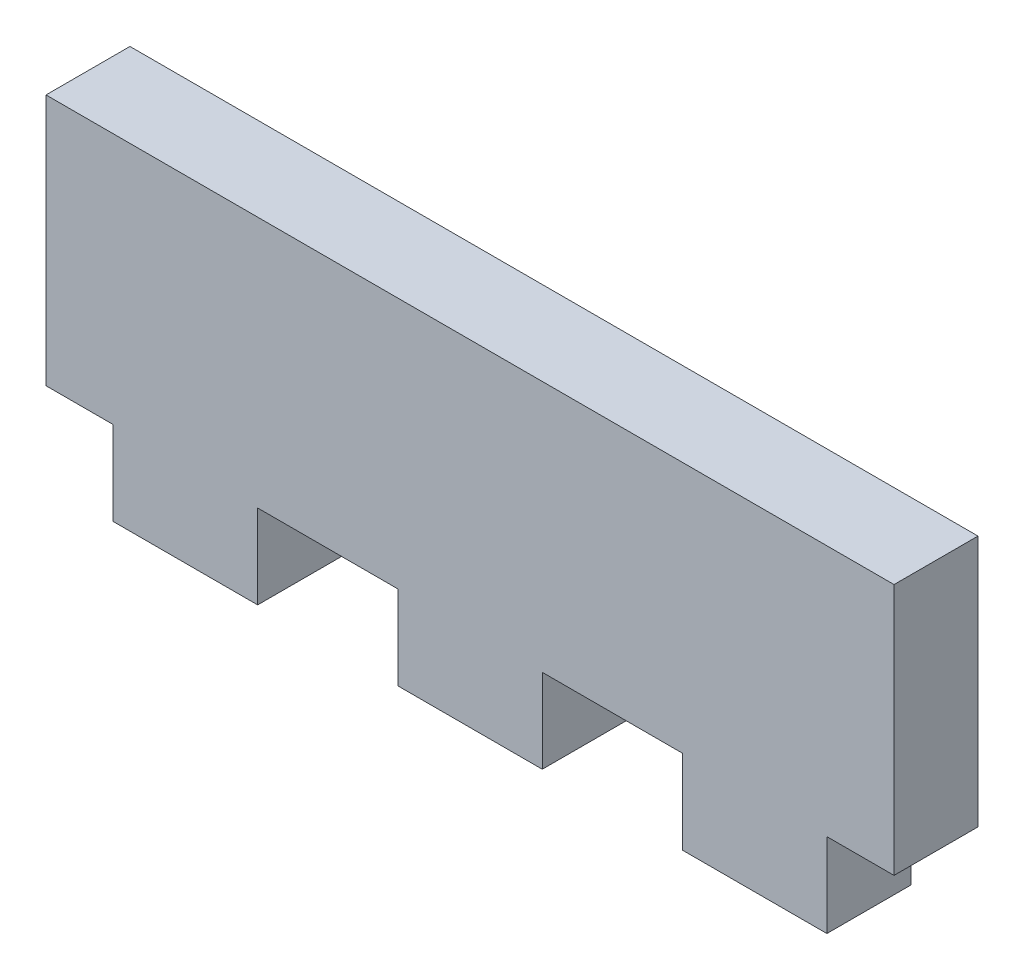
ISO-10303-21;
HEADER;
FILE_DESCRIPTION(('STEP AP214'),'2;1');
FILE_NAME('part.step','',(''),(''),'','','');
FILE_SCHEMA(('AUTOMOTIVE_DESIGN { 1 0 10303 214 1 1 1 1 }'));
ENDSEC;
DATA;
#1=APPLICATION_CONTEXT('core data for automotive mechanical design processes');
#2=APPLICATION_PROTOCOL_DEFINITION('international standard','automotive_design',2000,#1);
#3=PRODUCT_CONTEXT('',#1,'mechanical');
#4=PRODUCT('Part','Part','',(#3));
#5=PRODUCT_RELATED_PRODUCT_CATEGORY('part','',(#4));
#6=PRODUCT_DEFINITION_FORMATION('','',#4);
#7=PRODUCT_DEFINITION_CONTEXT('part definition',#1,'design');
#8=PRODUCT_DEFINITION('design','',#6,#7);
#9=PRODUCT_DEFINITION_SHAPE('','',#8);
#10=(LENGTH_UNIT() NAMED_UNIT(*) SI_UNIT(.MILLI.,.METRE.));
#11=(NAMED_UNIT(*) PLANE_ANGLE_UNIT() SI_UNIT($,.RADIAN.));
#12=(NAMED_UNIT(*) SI_UNIT($,.STERADIAN.) SOLID_ANGLE_UNIT());
#13=UNCERTAINTY_MEASURE_WITH_UNIT(LENGTH_MEASURE(1.E-05),#10,'distance_accuracy_value','');
#14=(GEOMETRIC_REPRESENTATION_CONTEXT(3) GLOBAL_UNCERTAINTY_ASSIGNED_CONTEXT((#13)) GLOBAL_UNIT_ASSIGNED_CONTEXT((#10,
#11,#12)) REPRESENTATION_CONTEXT('',''));
#15=CARTESIAN_POINT('',(0.,0.,0.));
#16=DIRECTION('',(0.,0.,1.));
#17=DIRECTION('',(1.,0.,0.));
#18=AXIS2_PLACEMENT_3D('',#15,#16,#17);
#19=CARTESIAN_POINT('',(-5.69647788398778,26.5399594891427,5.));
#20=DIRECTION('',(-1.,0.,0.));
#21=DIRECTION('',(0.,0.,1.));
#22=AXIS2_PLACEMENT_3D('',#19,#20,#21);
#23=PLANE('',#22);
#24=DIRECTION('',(0.,1.,0.));
#25=VECTOR('',#24,1.);
#26=CARTESIAN_POINT('',(-5.69647788398778,26.5399594891427,0.));
#27=LINE('',#26,#25);
#28=CARTESIAN_POINT('',(-5.69647788398778,26.5399594891427,0.));
#29=VERTEX_POINT('',#28);
#30=CARTESIAN_POINT('',(-5.69647788398778,31.5399594891427,0.));
#31=VERTEX_POINT('',#30);
#32=EDGE_CURVE('E176',#29,#31,#27,.T.);
#33=ORIENTED_EDGE('',*,*,#32,.T.);
#34=DIRECTION('',(0.,0.,-1.));
#35=VECTOR('',#34,1.);
#36=CARTESIAN_POINT('',(-5.69647788398778,31.5399594891427,5.));
#37=LINE('',#36,#35);
#38=CARTESIAN_POINT('',(-5.69647788398778,31.5399594891427,5.));
#39=VERTEX_POINT('',#38);
#40=EDGE_CURVE('E11',#39,#31,#37,.T.);
#41=ORIENTED_EDGE('',*,*,#40,.F.);
#42=DIRECTION('',(0.,1.,0.));
#43=VECTOR('',#42,1.);
#44=CARTESIAN_POINT('',(-5.69647788398778,26.5399594891427,5.));
#45=LINE('',#44,#43);
#46=CARTESIAN_POINT('',(-5.69647788398778,26.5399594891427,5.));
#47=VERTEX_POINT('',#46);
#48=EDGE_CURVE('E206',#47,#39,#45,.T.);
#49=ORIENTED_EDGE('',*,*,#48,.F.);
#50=DIRECTION('',(0.,0.,-1.));
#51=VECTOR('',#50,1.);
#52=CARTESIAN_POINT('',(-5.69647788398778,26.5399594891427,5.));
#53=LINE('',#52,#51);
#54=EDGE_CURVE('E172',#47,#29,#53,.T.);
#55=ORIENTED_EDGE('',*,*,#54,.T.);
#56=EDGE_LOOP('',(#33,#41,#49,#55));
#57=FACE_BOUND('',#56,.T.);
#58=ADVANCED_FACE('F32',(#57),#23,.F.);
#59=CARTESIAN_POINT('',(-5.69647788398778,31.5399594891427,5.));
#60=DIRECTION('',(0.,1.,0.));
#61=DIRECTION('',(0.,0.,1.));
#62=AXIS2_PLACEMENT_3D('',#59,#60,#61);
#63=PLANE('',#62);
#64=DIRECTION('',(1.,0.,0.));
#65=VECTOR('',#64,1.);
#66=CARTESIAN_POINT('',(-5.69647788398778,31.5399594891427,0.));
#67=LINE('',#66,#65);
#68=CARTESIAN_POINT('',(-1.69647788398778,31.5399594891427,0.));
#69=VERTEX_POINT('',#68);
#70=EDGE_CURVE('E179',#31,#69,#67,.T.);
#71=ORIENTED_EDGE('',*,*,#70,.T.);
#72=DIRECTION('',(0.,0.,-1.));
#73=VECTOR('',#72,1.);
#74=CARTESIAN_POINT('',(-1.69647788398778,31.5399594891427,5.));
#75=LINE('',#74,#73);
#76=CARTESIAN_POINT('',(-1.69647788398778,31.5399594891427,5.));
#77=VERTEX_POINT('',#76);
#78=EDGE_CURVE('E40',#77,#69,#75,.T.);
#79=ORIENTED_EDGE('',*,*,#78,.F.);
#80=DIRECTION('',(1.,0.,0.));
#81=VECTOR('',#80,1.);
#82=CARTESIAN_POINT('',(-5.69647788398778,31.5399594891427,5.));
#83=LINE('',#82,#81);
#84=EDGE_CURVE('E115',#39,#77,#83,.T.);
#85=ORIENTED_EDGE('',*,*,#84,.F.);
#86=ORIENTED_EDGE('',*,*,#40,.T.);
#87=EDGE_LOOP('',(#71,#79,#85,#86));
#88=FACE_BOUND('',#87,.T.);
#89=ADVANCED_FACE('F304',(#88),#63,.F.);
#90=CARTESIAN_POINT('',(-1.69647788398778,31.5399594891427,5.));
#91=DIRECTION('',(-1.,0.,0.));
#92=DIRECTION('',(0.,-1.,0.));
#93=AXIS2_PLACEMENT_3D('',#90,#91,#92);
#94=PLANE('',#93);
#95=DIRECTION('',(0.,1.,0.));
#96=VECTOR('',#95,1.);
#97=CARTESIAN_POINT('',(-1.69647788398778,31.5399594891427,0.));
#98=LINE('',#97,#96);
#99=CARTESIAN_POINT('',(-1.69647788398777,46.5399594891427,0.));
#100=VERTEX_POINT('',#99);
#101=EDGE_CURVE('E181',#69,#100,#98,.T.);
#102=ORIENTED_EDGE('',*,*,#101,.T.);
#103=DIRECTION('',(0.,0.,-1.));
#104=VECTOR('',#103,1.);
#105=CARTESIAN_POINT('',(-1.69647788398777,46.5399594891427,5.));
#106=LINE('',#105,#104);
#107=CARTESIAN_POINT('',(-1.69647788398777,46.5399594891427,5.));
#108=VERTEX_POINT('',#107);
#109=EDGE_CURVE('E237',#108,#100,#106,.T.);
#110=ORIENTED_EDGE('',*,*,#109,.F.);
#111=DIRECTION('',(0.,1.,0.));
#112=VECTOR('',#111,1.);
#113=CARTESIAN_POINT('',(-1.69647788398778,31.5399594891427,5.));
#114=LINE('',#113,#112);
#115=EDGE_CURVE('E245',#77,#108,#114,.T.);
#116=ORIENTED_EDGE('',*,*,#115,.F.);
#117=ORIENTED_EDGE('',*,*,#78,.T.);
#118=EDGE_LOOP('',(#102,#110,#116,#117));
#119=FACE_BOUND('',#118,.T.);
#120=ADVANCED_FACE('F243',(#119),#94,.F.);
#121=CARTESIAN_POINT('',(-52.1991778839878,46.5399594891427,5.));
#122=DIRECTION('',(0.,-1.,0.));
#123=DIRECTION('',(0.,0.,-1.));
#124=AXIS2_PLACEMENT_3D('',#121,#122,#123);
#125=PLANE('',#124);
#126=DIRECTION('',(-1.,0.,0.));
#127=VECTOR('',#126,1.);
#128=CARTESIAN_POINT('',(-52.1991778839878,46.5399594891427,0.));
#129=LINE('',#128,#127);
#130=CARTESIAN_POINT('',(-52.1991778839878,46.5399594891427,0.));
#131=VERTEX_POINT('',#130);
#132=EDGE_CURVE('E183',#100,#131,#129,.T.);
#133=ORIENTED_EDGE('',*,*,#132,.T.);
#134=DIRECTION('',(0.,0.,-1.));
#135=VECTOR('',#134,1.);
#136=CARTESIAN_POINT('',(-52.1991778839878,46.5399594891427,5.));
#137=LINE('',#136,#135);
#138=CARTESIAN_POINT('',(-52.1991778839878,46.5399594891427,5.));
#139=VERTEX_POINT('',#138);
#140=EDGE_CURVE('E234',#139,#131,#137,.T.);
#141=ORIENTED_EDGE('',*,*,#140,.F.);
#142=DIRECTION('',(-1.,0.,0.));
#143=VECTOR('',#142,1.);
#144=CARTESIAN_POINT('',(-52.1991778839878,46.5399594891427,5.));
#145=LINE('',#144,#143);
#146=EDGE_CURVE('E263',#108,#139,#145,.T.);
#147=ORIENTED_EDGE('',*,*,#146,.F.);
#148=ORIENTED_EDGE('',*,*,#109,.T.);
#149=EDGE_LOOP('',(#133,#141,#147,#148));
#150=FACE_BOUND('',#149,.T.);
#151=ADVANCED_FACE('F254',(#150),#125,.F.);
#152=CARTESIAN_POINT('',(-52.1991778839878,31.5399594891427,5.));
#153=DIRECTION('',(1.,0.,0.));
#154=DIRECTION('',(0.,0.,-1.));
#155=AXIS2_PLACEMENT_3D('',#152,#153,#154);
#156=PLANE('',#155);
#157=DIRECTION('',(0.,-1.,0.));
#158=VECTOR('',#157,1.);
#159=CARTESIAN_POINT('',(-52.1991778839878,31.5399594891427,0.));
#160=LINE('',#159,#158);
#161=CARTESIAN_POINT('',(-52.1991778839878,31.5399594891427,0.));
#162=VERTEX_POINT('',#161);
#163=EDGE_CURVE('E185',#131,#162,#160,.T.);
#164=ORIENTED_EDGE('',*,*,#163,.T.);
#165=DIRECTION('',(0.,0.,-1.));
#166=VECTOR('',#165,1.);
#167=CARTESIAN_POINT('',(-52.1991778839878,31.5399594891427,5.));
#168=LINE('',#167,#166);
#169=CARTESIAN_POINT('',(-52.1991778839878,31.5399594891427,5.));
#170=VERTEX_POINT('',#169);
#171=EDGE_CURVE('E231',#170,#162,#168,.T.);
#172=ORIENTED_EDGE('',*,*,#171,.F.);
#173=DIRECTION('',(0.,-1.,0.));
#174=VECTOR('',#173,1.);
#175=CARTESIAN_POINT('',(-52.1991778839878,31.5399594891427,5.));
#176=LINE('',#175,#174);
#177=EDGE_CURVE('E260',#139,#170,#176,.T.);
#178=ORIENTED_EDGE('',*,*,#177,.F.);
#179=ORIENTED_EDGE('',*,*,#140,.T.);
#180=EDGE_LOOP('',(#164,#172,#178,#179));
#181=FACE_BOUND('',#180,.T.);
#182=ADVANCED_FACE('F258',(#181),#156,.F.);
#183=CARTESIAN_POINT('',(-48.1991778839878,31.5399594891427,5.));
#184=DIRECTION('',(0.,1.,0.));
#185=DIRECTION('',(0.,0.,1.));
#186=AXIS2_PLACEMENT_3D('',#183,#184,#185);
#187=PLANE('',#186);
#188=DIRECTION('',(1.,0.,0.));
#189=VECTOR('',#188,1.);
#190=CARTESIAN_POINT('',(-48.1991778839878,31.5399594891427,0.));
#191=LINE('',#190,#189);
#192=CARTESIAN_POINT('',(-48.1991778839878,31.5399594891427,0.));
#193=VERTEX_POINT('',#192);
#194=EDGE_CURVE('E187',#162,#193,#191,.T.);
#195=ORIENTED_EDGE('',*,*,#194,.T.);
#196=DIRECTION('',(0.,0.,-1.));
#197=VECTOR('',#196,1.);
#198=CARTESIAN_POINT('',(-48.1991778839878,31.5399594891427,5.));
#199=LINE('',#198,#197);
#200=CARTESIAN_POINT('',(-48.1991778839878,31.5399594891427,5.));
#201=VERTEX_POINT('',#200);
#202=EDGE_CURVE('E228',#201,#193,#199,.T.);
#203=ORIENTED_EDGE('',*,*,#202,.F.);
#204=DIRECTION('',(1.,0.,0.));
#205=VECTOR('',#204,1.);
#206=CARTESIAN_POINT('',(-48.1991778839878,31.5399594891427,5.));
#207=LINE('',#206,#205);
#208=EDGE_CURVE('E262',#170,#201,#207,.T.);
#209=ORIENTED_EDGE('',*,*,#208,.F.);
#210=ORIENTED_EDGE('',*,*,#171,.T.);
#211=EDGE_LOOP('',(#195,#203,#209,#210));
#212=FACE_BOUND('',#211,.T.);
#213=ADVANCED_FACE('F317',(#212),#187,.F.);
#214=CARTESIAN_POINT('',(-48.1991778839878,26.5399594891427,5.));
#215=DIRECTION('',(1.,0.,0.));
#216=DIRECTION('',(0.,0.,-1.));
#217=AXIS2_PLACEMENT_3D('',#214,#215,#216);
#218=PLANE('',#217);
#219=DIRECTION('',(0.,-1.,0.));
#220=VECTOR('',#219,1.);
#221=CARTESIAN_POINT('',(-48.1991778839878,26.5399594891427,0.));
#222=LINE('',#221,#220);
#223=CARTESIAN_POINT('',(-48.1991778839878,26.5399594891427,0.));
#224=VERTEX_POINT('',#223);
#225=EDGE_CURVE('E189',#193,#224,#222,.T.);
#226=ORIENTED_EDGE('',*,*,#225,.T.);
#227=DIRECTION('',(0.,0.,-1.));
#228=VECTOR('',#227,1.);
#229=CARTESIAN_POINT('',(-48.1991778839878,26.5399594891427,5.));
#230=LINE('',#229,#228);
#231=CARTESIAN_POINT('',(-48.1991778839878,26.5399594891427,5.));
#232=VERTEX_POINT('',#231);
#233=EDGE_CURVE('E225',#232,#224,#230,.T.);
#234=ORIENTED_EDGE('',*,*,#233,.F.);
#235=DIRECTION('',(0.,-1.,0.));
#236=VECTOR('',#235,1.);
#237=CARTESIAN_POINT('',(-48.1991778839878,26.5399594891427,5.));
#238=LINE('',#237,#236);
#239=EDGE_CURVE('E265',#201,#232,#238,.T.);
#240=ORIENTED_EDGE('',*,*,#239,.F.);
#241=ORIENTED_EDGE('',*,*,#202,.T.);
#242=EDGE_LOOP('',(#226,#234,#240,#241));
#243=FACE_BOUND('',#242,.T.);
#244=ADVANCED_FACE('F320',(#243),#218,.F.);
#245=CARTESIAN_POINT('',(-39.5948778839878,26.5399594891427,5.));
#246=DIRECTION('',(0.,1.,0.));
#247=DIRECTION('',(0.,0.,1.));
#248=AXIS2_PLACEMENT_3D('',#245,#246,#247);
#249=PLANE('',#248);
#250=DIRECTION('',(1.,0.,0.));
#251=VECTOR('',#250,1.);
#252=CARTESIAN_POINT('',(-39.5948778839878,26.5399594891427,0.));
#253=LINE('',#252,#251);
#254=CARTESIAN_POINT('',(-39.5948778839878,26.5399594891427,0.));
#255=VERTEX_POINT('',#254);
#256=EDGE_CURVE('E191',#224,#255,#253,.T.);
#257=ORIENTED_EDGE('',*,*,#256,.T.);
#258=DIRECTION('',(0.,0.,-1.));
#259=VECTOR('',#258,1.);
#260=CARTESIAN_POINT('',(-39.5948778839878,26.5399594891427,5.));
#261=LINE('',#260,#259);
#262=CARTESIAN_POINT('',(-39.5948778839878,26.5399594891427,5.));
#263=VERTEX_POINT('',#262);
#264=EDGE_CURVE('E222',#263,#255,#261,.T.);
#265=ORIENTED_EDGE('',*,*,#264,.F.);
#266=DIRECTION('',(1.,0.,0.));
#267=VECTOR('',#266,1.);
#268=CARTESIAN_POINT('',(-39.5948778839878,26.5399594891427,5.));
#269=LINE('',#268,#267);
#270=EDGE_CURVE('E271',#232,#263,#269,.T.);
#271=ORIENTED_EDGE('',*,*,#270,.F.);
#272=ORIENTED_EDGE('',*,*,#233,.T.);
#273=EDGE_LOOP('',(#257,#265,#271,#272));
#274=FACE_BOUND('',#273,.T.);
#275=ADVANCED_FACE('F324',(#274),#249,.F.);
#276=CARTESIAN_POINT('',(-39.5948778839878,26.5399594891427,5.));
#277=DIRECTION('',(-1.,0.,0.));
#278=DIRECTION('',(0.,0.,1.));
#279=AXIS2_PLACEMENT_3D('',#276,#277,#278);
#280=PLANE('',#279);
#281=DIRECTION('',(0.,1.,0.));
#282=VECTOR('',#281,1.);
#283=CARTESIAN_POINT('',(-39.5948778839878,26.5399594891427,0.));
#284=LINE('',#283,#282);
#285=CARTESIAN_POINT('',(-39.5948778839878,31.5399594891427,0.));
#286=VERTEX_POINT('',#285);
#287=EDGE_CURVE('E193',#255,#286,#284,.T.);
#288=ORIENTED_EDGE('',*,*,#287,.T.);
#289=DIRECTION('',(0.,0.,-1.));
#290=VECTOR('',#289,1.);
#291=CARTESIAN_POINT('',(-39.5948778839878,31.5399594891427,5.));
#292=LINE('',#291,#290);
#293=CARTESIAN_POINT('',(-39.5948778839878,31.5399594891427,5.));
#294=VERTEX_POINT('',#293);
#295=EDGE_CURVE('E219',#294,#286,#292,.T.);
#296=ORIENTED_EDGE('',*,*,#295,.F.);
#297=DIRECTION('',(0.,1.,0.));
#298=VECTOR('',#297,1.);
#299=CARTESIAN_POINT('',(-39.5948778839878,26.5399594891427,5.));
#300=LINE('',#299,#298);
#301=EDGE_CURVE('E273',#263,#294,#300,.T.);
#302=ORIENTED_EDGE('',*,*,#301,.F.);
#303=ORIENTED_EDGE('',*,*,#264,.T.);
#304=EDGE_LOOP('',(#288,#296,#302,#303));
#305=FACE_BOUND('',#304,.T.);
#306=ADVANCED_FACE('F328',(#305),#280,.F.);
#307=CARTESIAN_POINT('',(-31.2481778839878,31.5399594891427,5.));
#308=DIRECTION('',(0.,1.,0.));
#309=DIRECTION('',(0.,0.,1.));
#310=AXIS2_PLACEMENT_3D('',#307,#308,#309);
#311=PLANE('',#310);
#312=DIRECTION('',(1.,0.,0.));
#313=VECTOR('',#312,1.);
#314=CARTESIAN_POINT('',(-31.2481778839878,31.5399594891427,0.));
#315=LINE('',#314,#313);
#316=CARTESIAN_POINT('',(-31.2481778839878,31.5399594891427,0.));
#317=VERTEX_POINT('',#316);
#318=EDGE_CURVE('E195',#286,#317,#315,.T.);
#319=ORIENTED_EDGE('',*,*,#318,.T.);
#320=DIRECTION('',(0.,0.,-1.));
#321=VECTOR('',#320,1.);
#322=CARTESIAN_POINT('',(-31.2481778839878,31.5399594891427,5.));
#323=LINE('',#322,#321);
#324=CARTESIAN_POINT('',(-31.2481778839878,31.5399594891427,5.));
#325=VERTEX_POINT('',#324);
#326=EDGE_CURVE('E216',#325,#317,#323,.T.);
#327=ORIENTED_EDGE('',*,*,#326,.F.);
#328=DIRECTION('',(1.,0.,0.));
#329=VECTOR('',#328,1.);
#330=CARTESIAN_POINT('',(-31.2481778839878,31.5399594891427,5.));
#331=LINE('',#330,#329);
#332=EDGE_CURVE('E275',#294,#325,#331,.T.);
#333=ORIENTED_EDGE('',*,*,#332,.F.);
#334=ORIENTED_EDGE('',*,*,#295,.T.);
#335=EDGE_LOOP('',(#319,#327,#333,#334));
#336=FACE_BOUND('',#335,.T.);
#337=ADVANCED_FACE('F332',(#336),#311,.F.);
#338=CARTESIAN_POINT('',(-31.2481778839878,26.5399594891427,5.));
#339=DIRECTION('',(1.,0.,0.));
#340=DIRECTION('',(0.,0.,-1.));
#341=AXIS2_PLACEMENT_3D('',#338,#339,#340);
#342=PLANE('',#341);
#343=DIRECTION('',(0.,-1.,0.));
#344=VECTOR('',#343,1.);
#345=CARTESIAN_POINT('',(-31.2481778839878,26.5399594891427,0.));
#346=LINE('',#345,#344);
#347=CARTESIAN_POINT('',(-31.2481778839878,26.5399594891427,0.));
#348=VERTEX_POINT('',#347);
#349=EDGE_CURVE('E197',#317,#348,#346,.T.);
#350=ORIENTED_EDGE('',*,*,#349,.T.);
#351=DIRECTION('',(0.,0.,-1.));
#352=VECTOR('',#351,1.);
#353=CARTESIAN_POINT('',(-31.2481778839878,26.5399594891427,5.));
#354=LINE('',#353,#352);
#355=CARTESIAN_POINT('',(-31.2481778839878,26.5399594891427,5.));
#356=VERTEX_POINT('',#355);
#357=EDGE_CURVE('E213',#356,#348,#354,.T.);
#358=ORIENTED_EDGE('',*,*,#357,.F.);
#359=DIRECTION('',(0.,-1.,0.));
#360=VECTOR('',#359,1.);
#361=CARTESIAN_POINT('',(-31.2481778839878,26.5399594891427,5.));
#362=LINE('',#361,#360);
#363=EDGE_CURVE('E277',#325,#356,#362,.T.);
#364=ORIENTED_EDGE('',*,*,#363,.F.);
#365=ORIENTED_EDGE('',*,*,#326,.T.);
#366=EDGE_LOOP('',(#350,#358,#364,#365));
#367=FACE_BOUND('',#366,.T.);
#368=ADVANCED_FACE('F336',(#367),#342,.F.);
#369=CARTESIAN_POINT('',(-22.6439778839878,26.5399594891427,5.));
#370=DIRECTION('',(0.,1.,0.));
#371=DIRECTION('',(0.,0.,1.));
#372=AXIS2_PLACEMENT_3D('',#369,#370,#371);
#373=PLANE('',#372);
#374=DIRECTION('',(1.,0.,0.));
#375=VECTOR('',#374,1.);
#376=CARTESIAN_POINT('',(-22.6439778839878,26.5399594891427,0.));
#377=LINE('',#376,#375);
#378=CARTESIAN_POINT('',(-22.6439778839878,26.5399594891427,0.));
#379=VERTEX_POINT('',#378);
#380=EDGE_CURVE('E199',#348,#379,#377,.T.);
#381=ORIENTED_EDGE('',*,*,#380,.T.);
#382=DIRECTION('',(0.,0.,-1.));
#383=VECTOR('',#382,1.);
#384=CARTESIAN_POINT('',(-22.6439778839878,26.5399594891427,5.));
#385=LINE('',#384,#383);
#386=CARTESIAN_POINT('',(-22.6439778839878,26.5399594891427,5.));
#387=VERTEX_POINT('',#386);
#388=EDGE_CURVE('E210',#387,#379,#385,.T.);
#389=ORIENTED_EDGE('',*,*,#388,.F.);
#390=DIRECTION('',(1.,0.,0.));
#391=VECTOR('',#390,1.);
#392=CARTESIAN_POINT('',(-22.6439778839878,26.5399594891427,5.));
#393=LINE('',#392,#391);
#394=EDGE_CURVE('E279',#356,#387,#393,.T.);
#395=ORIENTED_EDGE('',*,*,#394,.F.);
#396=ORIENTED_EDGE('',*,*,#357,.T.);
#397=EDGE_LOOP('',(#381,#389,#395,#396));
#398=FACE_BOUND('',#397,.T.);
#399=ADVANCED_FACE('F285',(#398),#373,.F.);
#400=CARTESIAN_POINT('',(-22.6439778839878,26.5399594891427,5.));
#401=DIRECTION('',(-1.,0.,0.));
#402=DIRECTION('',(0.,0.,1.));
#403=AXIS2_PLACEMENT_3D('',#400,#401,#402);
#404=PLANE('',#403);
#405=DIRECTION('',(0.,1.,0.));
#406=VECTOR('',#405,1.);
#407=CARTESIAN_POINT('',(-22.6439778839878,26.5399594891427,0.));
#408=LINE('',#407,#406);
#409=CARTESIAN_POINT('',(-22.6439778839878,31.5399594891427,0.));
#410=VERTEX_POINT('',#409);
#411=EDGE_CURVE('E201',#379,#410,#408,.T.);
#412=ORIENTED_EDGE('',*,*,#411,.T.);
#413=DIRECTION('',(0.,0.,-1.));
#414=VECTOR('',#413,1.);
#415=CARTESIAN_POINT('',(-22.6439778839878,31.5399594891427,5.));
#416=LINE('',#415,#414);
#417=CARTESIAN_POINT('',(-22.6439778839878,31.5399594891427,5.));
#418=VERTEX_POINT('',#417);
#419=EDGE_CURVE('E167',#418,#410,#416,.T.);
#420=ORIENTED_EDGE('',*,*,#419,.F.);
#421=DIRECTION('',(0.,1.,0.));
#422=VECTOR('',#421,1.);
#423=CARTESIAN_POINT('',(-22.6439778839878,26.5399594891427,5.));
#424=LINE('',#423,#422);
#425=EDGE_CURVE('E158',#387,#418,#424,.T.);
#426=ORIENTED_EDGE('',*,*,#425,.F.);
#427=ORIENTED_EDGE('',*,*,#388,.T.);
#428=EDGE_LOOP('',(#412,#420,#426,#427));
#429=FACE_BOUND('',#428,.T.);
#430=ADVANCED_FACE('F289',(#429),#404,.F.);
#431=CARTESIAN_POINT('',(-22.6439778839878,31.5399594891427,5.));
#432=DIRECTION('',(0.,1.,0.));
#433=DIRECTION('',(0.,0.,1.));
#434=AXIS2_PLACEMENT_3D('',#431,#432,#433);
#435=PLANE('',#434);
#436=DIRECTION('',(1.,0.,0.));
#437=VECTOR('',#436,1.);
#438=CARTESIAN_POINT('',(-22.6439778839878,31.5399594891427,0.));
#439=LINE('',#438,#437);
#440=CARTESIAN_POINT('',(-14.2971778839878,31.5399594891427,0.));
#441=VERTEX_POINT('',#440);
#442=EDGE_CURVE('E166',#410,#441,#439,.T.);
#443=ORIENTED_EDGE('',*,*,#442,.T.);
#444=DIRECTION('',(0.,0.,-1.));
#445=VECTOR('',#444,1.);
#446=CARTESIAN_POINT('',(-14.2971778839878,31.5399594891427,5.));
#447=LINE('',#446,#445);
#448=CARTESIAN_POINT('',(-14.2971778839878,31.5399594891427,5.));
#449=VERTEX_POINT('',#448);
#450=EDGE_CURVE('E163',#449,#441,#447,.T.);
#451=ORIENTED_EDGE('',*,*,#450,.F.);
#452=DIRECTION('',(1.,0.,0.));
#453=VECTOR('',#452,1.);
#454=CARTESIAN_POINT('',(-22.6439778839878,31.5399594891427,5.));
#455=LINE('',#454,#453);
#456=EDGE_CURVE('E152',#418,#449,#455,.T.);
#457=ORIENTED_EDGE('',*,*,#456,.F.);
#458=ORIENTED_EDGE('',*,*,#419,.T.);
#459=EDGE_LOOP('',(#443,#451,#457,#458));
#460=FACE_BOUND('',#459,.T.);
#461=ADVANCED_FACE('F164',(#460),#435,.F.);
#462=CARTESIAN_POINT('',(-14.2971778839878,31.5399594891427,5.));
#463=DIRECTION('',(1.,0.,0.));
#464=DIRECTION('',(0.,1.,0.));
#465=AXIS2_PLACEMENT_3D('',#462,#463,#464);
#466=PLANE('',#465);
#467=DIRECTION('',(0.,-1.,0.));
#468=VECTOR('',#467,1.);
#469=CARTESIAN_POINT('',(-14.2971778839878,31.5399594891427,0.));
#470=LINE('',#469,#468);
#471=CARTESIAN_POINT('',(-14.2971778839878,26.5399594891427,0.));
#472=VERTEX_POINT('',#471);
#473=EDGE_CURVE('E101',#441,#472,#470,.T.);
#474=ORIENTED_EDGE('',*,*,#473,.T.);
#475=DIRECTION('',(0.,0.,-1.));
#476=VECTOR('',#475,1.);
#477=CARTESIAN_POINT('',(-14.2971778839878,26.5399594891427,5.));
#478=LINE('',#477,#476);
#479=CARTESIAN_POINT('',(-14.2971778839878,26.5399594891427,5.));
#480=VERTEX_POINT('',#479);
#481=EDGE_CURVE('E168',#480,#472,#478,.T.);
#482=ORIENTED_EDGE('',*,*,#481,.F.);
#483=DIRECTION('',(0.,-1.,0.));
#484=VECTOR('',#483,1.);
#485=CARTESIAN_POINT('',(-14.2971778839878,31.5399594891427,5.));
#486=LINE('',#485,#484);
#487=EDGE_CURVE('E156',#449,#480,#486,.T.);
#488=ORIENTED_EDGE('',*,*,#487,.F.);
#489=ORIENTED_EDGE('',*,*,#450,.T.);
#490=EDGE_LOOP('',(#474,#482,#488,#489));
#491=FACE_BOUND('',#490,.T.);
#492=ADVANCED_FACE('F170',(#491),#466,.F.);
#493=CARTESIAN_POINT('',(-5.69647788398778,26.5399594891427,5.));
#494=DIRECTION('',(0.,1.,0.));
#495=DIRECTION('',(0.,0.,1.));
#496=AXIS2_PLACEMENT_3D('',#493,#494,#495);
#497=PLANE('',#496);
#498=DIRECTION('',(1.,0.,0.));
#499=VECTOR('',#498,1.);
#500=CARTESIAN_POINT('',(-5.69647788398778,26.5399594891427,0.));
#501=LINE('',#500,#499);
#502=EDGE_CURVE('E107',#472,#29,#501,.T.);
#503=ORIENTED_EDGE('',*,*,#502,.T.);
#504=ORIENTED_EDGE('',*,*,#54,.F.);
#505=DIRECTION('',(1.,0.,0.));
#506=VECTOR('',#505,1.);
#507=CARTESIAN_POINT('',(-5.69647788398778,26.5399594891427,5.));
#508=LINE('',#507,#506);
#509=EDGE_CURVE('E48',#480,#47,#508,.T.);
#510=ORIENTED_EDGE('',*,*,#509,.F.);
#511=ORIENTED_EDGE('',*,*,#481,.T.);
#512=EDGE_LOOP('',(#503,#504,#510,#511));
#513=FACE_BOUND('',#512,.T.);
#514=ADVANCED_FACE('F293',(#513),#497,.F.);
#515=CARTESIAN_POINT('',(0.,0.,5.));
#516=DIRECTION('',(0.,0.,-1.));
#517=DIRECTION('',(-1.,0.,0.));
#518=AXIS2_PLACEMENT_3D('',#515,#516,#517);
#519=PLANE('',#518);
#520=ORIENTED_EDGE('',*,*,#48,.T.);
#521=ORIENTED_EDGE('',*,*,#84,.T.);
#522=ORIENTED_EDGE('',*,*,#115,.T.);
#523=ORIENTED_EDGE('',*,*,#146,.T.);
#524=ORIENTED_EDGE('',*,*,#177,.T.);
#525=ORIENTED_EDGE('',*,*,#208,.T.);
#526=ORIENTED_EDGE('',*,*,#239,.T.);
#527=ORIENTED_EDGE('',*,*,#270,.T.);
#528=ORIENTED_EDGE('',*,*,#301,.T.);
#529=ORIENTED_EDGE('',*,*,#332,.T.);
#530=ORIENTED_EDGE('',*,*,#363,.T.);
#531=ORIENTED_EDGE('',*,*,#394,.T.);
#532=ORIENTED_EDGE('',*,*,#425,.T.);
#533=ORIENTED_EDGE('',*,*,#456,.T.);
#534=ORIENTED_EDGE('',*,*,#487,.T.);
#535=ORIENTED_EDGE('',*,*,#509,.T.);
#536=EDGE_LOOP('',(#520,#521,#522,#523,#524,#525,#526,#527,#528,#529,#530,#531,#532,#533,#534,#535));
#537=FACE_BOUND('',#536,.T.);
#538=ADVANCED_FACE('F154',(#537),#519,.F.);
#539=CARTESIAN_POINT('',(0.,0.,0.));
#540=DIRECTION('',(0.,0.,-1.));
#541=DIRECTION('',(-1.,0.,0.));
#542=AXIS2_PLACEMENT_3D('',#539,#540,#541);
#543=PLANE('',#542);
#544=ORIENTED_EDGE('',*,*,#32,.F.);
#545=ORIENTED_EDGE('',*,*,#502,.F.);
#546=ORIENTED_EDGE('',*,*,#473,.F.);
#547=ORIENTED_EDGE('',*,*,#442,.F.);
#548=ORIENTED_EDGE('',*,*,#411,.F.);
#549=ORIENTED_EDGE('',*,*,#380,.F.);
#550=ORIENTED_EDGE('',*,*,#349,.F.);
#551=ORIENTED_EDGE('',*,*,#318,.F.);
#552=ORIENTED_EDGE('',*,*,#287,.F.);
#553=ORIENTED_EDGE('',*,*,#256,.F.);
#554=ORIENTED_EDGE('',*,*,#225,.F.);
#555=ORIENTED_EDGE('',*,*,#194,.F.);
#556=ORIENTED_EDGE('',*,*,#163,.F.);
#557=ORIENTED_EDGE('',*,*,#132,.F.);
#558=ORIENTED_EDGE('',*,*,#101,.F.);
#559=ORIENTED_EDGE('',*,*,#70,.F.);
#560=EDGE_LOOP('',(#544,#545,#546,#547,#548,#549,#550,#551,#552,#553,#554,#555,#556,#557,#558,#559));
#561=FACE_BOUND('',#560,.T.);
#562=ADVANCED_FACE('F249',(#561),#543,.T.);
#563=CLOSED_SHELL('',(#58,#89,#120,#151,#182,#213,#244,#275,#306,#337,#368,#399,#430,#461,#492,
#514,#538,#562));
#564=MANIFOLD_SOLID_BREP('B2',#563);
#565=ADVANCED_BREP_SHAPE_REPRESENTATION('',(#18,#564),#14);
#566=SHAPE_DEFINITION_REPRESENTATION(#9,#565);
ENDSEC;
END-ISO-10303-21;
